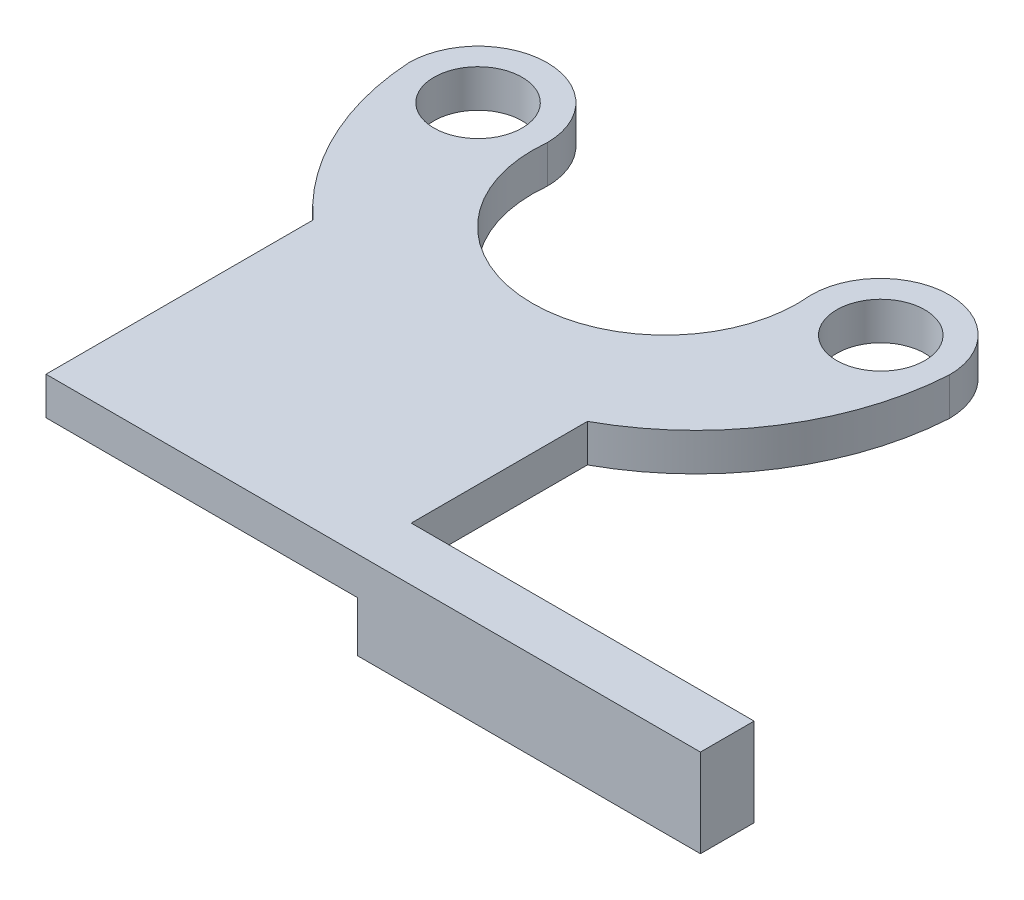
ISO-10303-21;
HEADER;
FILE_DESCRIPTION(('STEP AP214'),'2;1');
FILE_NAME('part.step','',(''),(''),'','','');
FILE_SCHEMA(('AUTOMOTIVE_DESIGN { 1 0 10303 214 1 1 1 1 }'));
ENDSEC;
DATA;
#1=APPLICATION_CONTEXT('core data for automotive mechanical design processes');
#2=APPLICATION_PROTOCOL_DEFINITION('international standard','automotive_design',2000,#1);
#3=PRODUCT_CONTEXT('',#1,'mechanical');
#4=PRODUCT('Part','Part','',(#3));
#5=PRODUCT_RELATED_PRODUCT_CATEGORY('part','',(#4));
#6=PRODUCT_DEFINITION_FORMATION('','',#4);
#7=PRODUCT_DEFINITION_CONTEXT('part definition',#1,'design');
#8=PRODUCT_DEFINITION('design','',#6,#7);
#9=PRODUCT_DEFINITION_SHAPE('','',#8);
#10=(LENGTH_UNIT() NAMED_UNIT(*) SI_UNIT(.MILLI.,.METRE.));
#11=(NAMED_UNIT(*) PLANE_ANGLE_UNIT() SI_UNIT($,.RADIAN.));
#12=(NAMED_UNIT(*) SI_UNIT($,.STERADIAN.) SOLID_ANGLE_UNIT());
#13=UNCERTAINTY_MEASURE_WITH_UNIT(LENGTH_MEASURE(1.E-05),#10,'distance_accuracy_value','');
#14=(GEOMETRIC_REPRESENTATION_CONTEXT(3) GLOBAL_UNCERTAINTY_ASSIGNED_CONTEXT((#13)) GLOBAL_UNIT_ASSIGNED_CONTEXT((#10,
#11,#12)) REPRESENTATION_CONTEXT('',''));
#15=CARTESIAN_POINT('',(0.,0.,0.));
#16=DIRECTION('',(0.,0.,1.));
#17=DIRECTION('',(1.,0.,0.));
#18=AXIS2_PLACEMENT_3D('',#15,#16,#17);
#19=CARTESIAN_POINT('',(-0.00974471247959803,1.5,0.557573359080302));
#20=DIRECTION('',(0.,1.,0.));
#21=DIRECTION('',(0.,0.,1.));
#22=AXIS2_PLACEMENT_3D('',#19,#20,#21);
#23=PLANE('',#22);
#24=DIRECTION('',(1.,0.,0.));
#25=VECTOR('',#24,1.);
#26=CARTESIAN_POINT('',(-7.23910045960443,1.5,17.9247339354452));
#27=LINE('',#26,#25);
#28=CARTESIAN_POINT('',(-7.23910045960443,1.5,17.9247339354452));
#29=VERTEX_POINT('',#28);
#30=CARTESIAN_POINT('',(18.7608995403956,1.5,17.9247339354452));
#31=VERTEX_POINT('',#30);
#32=EDGE_CURVE('E198',#29,#31,#27,.T.);
#33=ORIENTED_EDGE('',*,*,#32,.T.);
#34=DIRECTION('',(0.,0.,-1.));
#35=VECTOR('',#34,1.);
#36=CARTESIAN_POINT('',(18.7608995403956,1.5,15.7927993639687));
#37=LINE('',#36,#35);
#38=CARTESIAN_POINT('',(18.7608995403956,1.5,15.7927993639687));
#39=VERTEX_POINT('',#38);
#40=EDGE_CURVE('E201',#31,#39,#37,.T.);
#41=ORIENTED_EDGE('',*,*,#40,.T.);
#42=DIRECTION('',(-1.,0.,0.));
#43=VECTOR('',#42,1.);
#44=CARTESIAN_POINT('',(18.7608995403956,1.5,15.7927993639687));
#45=LINE('',#44,#43);
#46=CARTESIAN_POINT('',(5.13878703281565,1.5,15.7927993639687));
#47=VERTEX_POINT('',#46);
#48=EDGE_CURVE('E126',#39,#47,#45,.T.);
#49=ORIENTED_EDGE('',*,*,#48,.T.);
#50=DIRECTION('',(0.,0.,-1.));
#51=VECTOR('',#50,1.);
#52=CARTESIAN_POINT('',(5.13878703281565,1.5,15.7927993639687));
#53=LINE('',#52,#51);
#54=CARTESIAN_POINT('',(5.13878703281565,1.5,8.79279936396866));
#55=VERTEX_POINT('',#54);
#56=EDGE_CURVE('E120',#47,#55,#53,.T.);
#57=ORIENTED_EDGE('',*,*,#56,.T.);
#58=CARTESIAN_POINT('',(-0.00974471247960191,1.5,-0.655785681920986));
#59=DIRECTION('',(0.,1.,0.));
#60=DIRECTION('',(0.,0.,-1.));
#61=AXIS2_PLACEMENT_3D('',#58,#59,#60);
#62=CIRCLE('',#61,10.7602573622438);
#63=CARTESIAN_POINT('',(10.7305105750408,1.5,0.));
#64=VERTEX_POINT('',#63);
#65=EDGE_CURVE('E124',#55,#64,#62,.T.);
#66=ORIENTED_EDGE('',*,*,#65,.T.);
#67=CARTESIAN_POINT('',(7.9805105750408,1.5,0.));
#68=DIRECTION('',(0.,1.,0.));
#69=DIRECTION('',(0.,0.,1.));
#70=AXIS2_PLACEMENT_3D('',#67,#68,#69);
#71=CIRCLE('',#70,2.75);
#72=CARTESIAN_POINT('',(5.2305105750408,1.5,0.));
#73=VERTEX_POINT('',#72);
#74=EDGE_CURVE('E58',#64,#73,#71,.T.);
#75=ORIENTED_EDGE('',*,*,#74,.T.);
#76=CARTESIAN_POINT('',(-0.00974471247959803,1.5,0.557573359080302));
#77=DIRECTION('',(0.,-1.,0.));
#78=DIRECTION('',(0.,0.,1.));
#79=AXIS2_PLACEMENT_3D('',#76,#77,#78);
#80=CIRCLE('',#79,5.26983524686888);
#81=CARTESIAN_POINT('',(-5.25,1.5,0.));
#82=VERTEX_POINT('',#81);
#83=EDGE_CURVE('E160',#73,#82,#80,.T.);
#84=ORIENTED_EDGE('',*,*,#83,.T.);
#85=CARTESIAN_POINT('',(-8.,1.5,0.));
#86=DIRECTION('',(0.,1.,0.));
#87=DIRECTION('',(0.,0.,1.));
#88=AXIS2_PLACEMENT_3D('',#85,#86,#87);
#89=CIRCLE('',#88,2.75);
#90=CARTESIAN_POINT('',(-10.75,1.5,0.));
#91=VERTEX_POINT('',#90);
#92=EDGE_CURVE('E99',#82,#91,#89,.T.);
#93=ORIENTED_EDGE('',*,*,#92,.T.);
#94=CARTESIAN_POINT('',(-0.00974471247960191,1.5,-0.655785681920986));
#95=DIRECTION('',(0.,1.,0.));
#96=DIRECTION('',(0.,0.,-1.));
#97=AXIS2_PLACEMENT_3D('',#94,#95,#96);
#98=CIRCLE('',#97,10.7602573622438);
#99=CARTESIAN_POINT('',(-7.23910045960442,1.5,7.31412987492376));
#100=VERTEX_POINT('',#99);
#101=EDGE_CURVE('E181',#91,#100,#98,.T.);
#102=ORIENTED_EDGE('',*,*,#101,.T.);
#103=DIRECTION('',(0.,0.,1.));
#104=VECTOR('',#103,1.);
#105=CARTESIAN_POINT('',(-7.23910045960442,1.5,7.31412987492375));
#106=LINE('',#105,#104);
#107=EDGE_CURVE('E202',#100,#29,#106,.T.);
#108=ORIENTED_EDGE('',*,*,#107,.T.);
#109=EDGE_LOOP('',(#33,#41,#49,#57,#66,#75,#84,#93,#102,#108));
#110=FACE_BOUND('',#109,.T.);
#111=CARTESIAN_POINT('',(-8.,1.5,0.));
#112=DIRECTION('',(0.,1.,0.));
#113=DIRECTION('',(0.,0.,1.));
#114=AXIS2_PLACEMENT_3D('',#111,#112,#113);
#115=CIRCLE('',#114,1.75);
#116=CARTESIAN_POINT('',(-8.,1.5,1.75));
#117=VERTEX_POINT('',#116);
#118=EDGE_CURVE('E148',#117,#117,#115,.T.);
#119=ORIENTED_EDGE('',*,*,#118,.F.);
#120=EDGE_LOOP('',(#119));
#121=FACE_BOUND('',#120,.T.);
#122=CARTESIAN_POINT('',(8.,1.5,0.));
#123=DIRECTION('',(0.,1.,0.));
#124=DIRECTION('',(0.,0.,1.));
#125=AXIS2_PLACEMENT_3D('',#122,#123,#124);
#126=CIRCLE('',#125,1.75);
#127=CARTESIAN_POINT('',(8.,1.5,1.75000000000006));
#128=VERTEX_POINT('',#127);
#129=EDGE_CURVE('E213',#128,#128,#126,.T.);
#130=ORIENTED_EDGE('',*,*,#129,.F.);
#131=EDGE_LOOP('',(#130));
#132=FACE_BOUND('',#131,.T.);
#133=ADVANCED_FACE('F41',(#110,#121,#132),#23,.T.);
#134=CARTESIAN_POINT('',(-0.00974471247959803,0.,0.557573359080302));
#135=DIRECTION('',(0.,1.,0.));
#136=DIRECTION('',(0.,0.,1.));
#137=AXIS2_PLACEMENT_3D('',#134,#135,#136);
#138=PLANE('',#137);
#139=DIRECTION('',(0.,0.,-1.));
#140=VECTOR('',#139,1.);
#141=CARTESIAN_POINT('',(5.13878703281565,0.,15.7927993639687));
#142=LINE('',#141,#140);
#143=CARTESIAN_POINT('',(5.13878703281565,0.,15.7927993639687));
#144=VERTEX_POINT('',#143);
#145=CARTESIAN_POINT('',(5.13878703281565,0.,8.79279936396866));
#146=VERTEX_POINT('',#145);
#147=EDGE_CURVE('E134',#144,#146,#142,.T.);
#148=ORIENTED_EDGE('',*,*,#147,.F.);
#149=DIRECTION('',(0.,0.,1.));
#150=VECTOR('',#149,1.);
#151=CARTESIAN_POINT('',(5.13878703281565,0.,0.557573359080302));
#152=LINE('',#151,#150);
#153=CARTESIAN_POINT('',(5.13878703281565,0.,17.9247339354452));
#154=VERTEX_POINT('',#153);
#155=EDGE_CURVE('E219',#144,#154,#152,.T.);
#156=ORIENTED_EDGE('',*,*,#155,.T.);
#157=DIRECTION('',(1.,0.,0.));
#158=VECTOR('',#157,1.);
#159=CARTESIAN_POINT('',(-7.23910045960443,0.,17.9247339354452));
#160=LINE('',#159,#158);
#161=CARTESIAN_POINT('',(-7.23910045960443,0.,17.9247339354452));
#162=VERTEX_POINT('',#161);
#163=EDGE_CURVE('E154',#162,#154,#160,.T.);
#164=ORIENTED_EDGE('',*,*,#163,.F.);
#165=DIRECTION('',(0.,0.,1.));
#166=VECTOR('',#165,1.);
#167=CARTESIAN_POINT('',(-7.23910045960442,0.,7.31412987492375));
#168=LINE('',#167,#166);
#169=CARTESIAN_POINT('',(-7.23910045960442,0.,7.31412987492376));
#170=VERTEX_POINT('',#169);
#171=EDGE_CURVE('E152',#170,#162,#168,.T.);
#172=ORIENTED_EDGE('',*,*,#171,.F.);
#173=CARTESIAN_POINT('',(-0.00974471247960191,0.,-0.655785681920986));
#174=DIRECTION('',(0.,1.,0.));
#175=DIRECTION('',(0.,0.,-1.));
#176=AXIS2_PLACEMENT_3D('',#173,#174,#175);
#177=CIRCLE('',#176,10.7602573622438);
#178=CARTESIAN_POINT('',(-10.75,0.,0.));
#179=VERTEX_POINT('',#178);
#180=EDGE_CURVE('E150',#179,#170,#177,.T.);
#181=ORIENTED_EDGE('',*,*,#180,.F.);
#182=CARTESIAN_POINT('',(-8.,0.,0.));
#183=DIRECTION('',(0.,1.,0.));
#184=DIRECTION('',(0.,0.,1.));
#185=AXIS2_PLACEMENT_3D('',#182,#183,#184);
#186=CIRCLE('',#185,2.75);
#187=CARTESIAN_POINT('',(-5.25,0.,0.));
#188=VERTEX_POINT('',#187);
#189=EDGE_CURVE('E147',#188,#179,#186,.T.);
#190=ORIENTED_EDGE('',*,*,#189,.F.);
#191=CARTESIAN_POINT('',(-0.00974471247959803,0.,0.557573359080302));
#192=DIRECTION('',(0.,-1.,0.));
#193=DIRECTION('',(0.,0.,1.));
#194=AXIS2_PLACEMENT_3D('',#191,#192,#193);
#195=CIRCLE('',#194,5.26983524686888);
#196=CARTESIAN_POINT('',(5.2305105750408,0.,0.));
#197=VERTEX_POINT('',#196);
#198=EDGE_CURVE('E144',#197,#188,#195,.T.);
#199=ORIENTED_EDGE('',*,*,#198,.F.);
#200=CARTESIAN_POINT('',(7.9805105750408,0.,0.));
#201=DIRECTION('',(0.,1.,0.));
#202=DIRECTION('',(0.,0.,1.));
#203=AXIS2_PLACEMENT_3D('',#200,#201,#202);
#204=CIRCLE('',#203,2.75);
#205=CARTESIAN_POINT('',(10.7305105750408,0.,0.));
#206=VERTEX_POINT('',#205);
#207=EDGE_CURVE('E91',#206,#197,#204,.T.);
#208=ORIENTED_EDGE('',*,*,#207,.F.);
#209=CARTESIAN_POINT('',(-0.00974471247960191,0.,-0.655785681920986));
#210=DIRECTION('',(0.,1.,0.));
#211=DIRECTION('',(0.,0.,-1.));
#212=AXIS2_PLACEMENT_3D('',#209,#210,#211);
#213=CIRCLE('',#212,10.7602573622438);
#214=EDGE_CURVE('E85',#146,#206,#213,.T.);
#215=ORIENTED_EDGE('',*,*,#214,.F.);
#216=EDGE_LOOP('',(#148,#156,#164,#172,#181,#190,#199,#208,#215));
#217=FACE_BOUND('',#216,.T.);
#218=CARTESIAN_POINT('',(-8.,0.,0.));
#219=DIRECTION('',(0.,1.,0.));
#220=DIRECTION('',(0.,0.,1.));
#221=AXIS2_PLACEMENT_3D('',#218,#219,#220);
#222=CIRCLE('',#221,1.75);
#223=CARTESIAN_POINT('',(-8.,0.,1.75));
#224=VERTEX_POINT('',#223);
#225=EDGE_CURVE('E210',#224,#224,#222,.T.);
#226=ORIENTED_EDGE('',*,*,#225,.T.);
#227=EDGE_LOOP('',(#226));
#228=FACE_BOUND('',#227,.T.);
#229=CARTESIAN_POINT('',(8.,0.,0.));
#230=DIRECTION('',(0.,1.,0.));
#231=DIRECTION('',(0.,0.,1.));
#232=AXIS2_PLACEMENT_3D('',#229,#230,#231);
#233=CIRCLE('',#232,1.75);
#234=CARTESIAN_POINT('',(8.,0.,1.75000000000006));
#235=VERTEX_POINT('',#234);
#236=EDGE_CURVE('E216',#235,#235,#233,.T.);
#237=ORIENTED_EDGE('',*,*,#236,.T.);
#238=EDGE_LOOP('',(#237));
#239=FACE_BOUND('',#238,.T.);
#240=ADVANCED_FACE('F184',(#217,#228,#239),#138,.F.);
#241=CARTESIAN_POINT('',(-0.00974471247959803,1.5,0.557573359080302));
#242=DIRECTION('',(0.,-1.,0.));
#243=DIRECTION('',(0.,0.,-1.));
#244=AXIS2_PLACEMENT_3D('',#241,#242,#243);
#245=CYLINDRICAL_SURFACE('',#244,5.26983524686888);
#246=ORIENTED_EDGE('',*,*,#198,.T.);
#247=DIRECTION('',(0.,-1.,0.));
#248=VECTOR('',#247,1.);
#249=CARTESIAN_POINT('',(-5.25,1.5,0.));
#250=LINE('',#249,#248);
#251=EDGE_CURVE('E11',#82,#188,#250,.T.);
#252=ORIENTED_EDGE('',*,*,#251,.F.);
#253=ORIENTED_EDGE('',*,*,#83,.F.);
#254=DIRECTION('',(0.,-1.,0.));
#255=VECTOR('',#254,1.);
#256=CARTESIAN_POINT('',(5.2305105750408,1.5,0.));
#257=LINE('',#256,#255);
#258=EDGE_CURVE('E140',#73,#197,#257,.T.);
#259=ORIENTED_EDGE('',*,*,#258,.T.);
#260=EDGE_LOOP('',(#246,#252,#253,#259));
#261=FACE_BOUND('',#260,.T.);
#262=ADVANCED_FACE('F43',(#261),#245,.F.);
#263=CARTESIAN_POINT('',(-8.,1.5,0.));
#264=DIRECTION('',(0.,-1.,0.));
#265=DIRECTION('',(0.,0.,-1.));
#266=AXIS2_PLACEMENT_3D('',#263,#264,#265);
#267=CYLINDRICAL_SURFACE('',#266,2.75);
#268=ORIENTED_EDGE('',*,*,#189,.T.);
#269=DIRECTION('',(0.,-1.,0.));
#270=VECTOR('',#269,1.);
#271=CARTESIAN_POINT('',(-10.75,1.5,0.));
#272=LINE('',#271,#270);
#273=EDGE_CURVE('E50',#91,#179,#272,.T.);
#274=ORIENTED_EDGE('',*,*,#273,.F.);
#275=ORIENTED_EDGE('',*,*,#92,.F.);
#276=ORIENTED_EDGE('',*,*,#251,.T.);
#277=EDGE_LOOP('',(#268,#274,#275,#276));
#278=FACE_BOUND('',#277,.T.);
#279=ADVANCED_FACE('F341',(#278),#267,.T.);
#280=CARTESIAN_POINT('',(-0.00974471247960191,1.5,-0.655785681920986));
#281=DIRECTION('',(0.,-1.,0.));
#282=DIRECTION('',(0.,0.,-1.));
#283=AXIS2_PLACEMENT_3D('',#280,#281,#282);
#284=CYLINDRICAL_SURFACE('',#283,10.7602573622438);
#285=ORIENTED_EDGE('',*,*,#180,.T.);
#286=DIRECTION('',(0.,-1.,0.));
#287=VECTOR('',#286,1.);
#288=CARTESIAN_POINT('',(-7.23910045960442,1.5,7.31412987492376));
#289=LINE('',#288,#287);
#290=EDGE_CURVE('E173',#100,#170,#289,.T.);
#291=ORIENTED_EDGE('',*,*,#290,.F.);
#292=ORIENTED_EDGE('',*,*,#101,.F.);
#293=ORIENTED_EDGE('',*,*,#273,.T.);
#294=EDGE_LOOP('',(#285,#291,#292,#293));
#295=FACE_BOUND('',#294,.T.);
#296=ADVANCED_FACE('F179',(#295),#284,.T.);
#297=CARTESIAN_POINT('',(-7.23910045960442,1.5,7.31412987492375));
#298=DIRECTION('',(1.,0.,0.));
#299=DIRECTION('',(0.,0.,-1.));
#300=AXIS2_PLACEMENT_3D('',#297,#298,#299);
#301=PLANE('',#300);
#302=ORIENTED_EDGE('',*,*,#171,.T.);
#303=DIRECTION('',(0.,-1.,0.));
#304=VECTOR('',#303,1.);
#305=CARTESIAN_POINT('',(-7.23910045960443,1.5,17.9247339354452));
#306=LINE('',#305,#304);
#307=EDGE_CURVE('E170',#29,#162,#306,.T.);
#308=ORIENTED_EDGE('',*,*,#307,.F.);
#309=ORIENTED_EDGE('',*,*,#107,.F.);
#310=ORIENTED_EDGE('',*,*,#290,.T.);
#311=EDGE_LOOP('',(#302,#308,#309,#310));
#312=FACE_BOUND('',#311,.T.);
#313=ADVANCED_FACE('F191',(#312),#301,.F.);
#314=CARTESIAN_POINT('',(-7.23910045960443,1.5,17.9247339354452));
#315=DIRECTION('',(0.,0.,-1.));
#316=DIRECTION('',(-1.,0.,0.));
#317=AXIS2_PLACEMENT_3D('',#314,#315,#316);
#318=PLANE('',#317);
#319=ORIENTED_EDGE('',*,*,#163,.T.);
#320=DIRECTION('',(0.,1.,0.));
#321=VECTOR('',#320,1.);
#322=CARTESIAN_POINT('',(5.13878703281565,-2.,17.9247339354452));
#323=LINE('',#322,#321);
#324=CARTESIAN_POINT('',(5.13878703281565,-2.,17.9247339354452));
#325=VERTEX_POINT('',#324);
#326=EDGE_CURVE('E224',#325,#154,#323,.T.);
#327=ORIENTED_EDGE('',*,*,#326,.F.);
#328=DIRECTION('',(1.,0.,0.));
#329=VECTOR('',#328,1.);
#330=CARTESIAN_POINT('',(5.13878703281565,-2.,17.9247339354452));
#331=LINE('',#330,#329);
#332=CARTESIAN_POINT('',(18.7608995403956,-2.,17.9247339354452));
#333=VERTEX_POINT('',#332);
#334=EDGE_CURVE('E235',#325,#333,#331,.T.);
#335=ORIENTED_EDGE('',*,*,#334,.T.);
#336=DIRECTION('',(0.,-1.,0.));
#337=VECTOR('',#336,1.);
#338=CARTESIAN_POINT('',(18.7608995403956,1.5,17.9247339354452));
#339=LINE('',#338,#337);
#340=EDGE_CURVE('E167',#31,#333,#339,.T.);
#341=ORIENTED_EDGE('',*,*,#340,.F.);
#342=ORIENTED_EDGE('',*,*,#32,.F.);
#343=ORIENTED_EDGE('',*,*,#307,.T.);
#344=EDGE_LOOP('',(#319,#327,#335,#341,#342,#343));
#345=FACE_BOUND('',#344,.T.);
#346=ADVANCED_FACE('F195',(#345),#318,.F.);
#347=CARTESIAN_POINT('',(18.7608995403956,1.5,15.7927993639687));
#348=DIRECTION('',(-1.,0.,0.));
#349=DIRECTION('',(0.,0.,1.));
#350=AXIS2_PLACEMENT_3D('',#347,#348,#349);
#351=PLANE('',#350);
#352=ORIENTED_EDGE('',*,*,#340,.T.);
#353=DIRECTION('',(0.,0.,-1.));
#354=VECTOR('',#353,1.);
#355=CARTESIAN_POINT('',(18.7608995403956,-2.,15.7927993639687));
#356=LINE('',#355,#354);
#357=CARTESIAN_POINT('',(18.7608995403956,-2.,15.7927993639687));
#358=VERTEX_POINT('',#357);
#359=EDGE_CURVE('E232',#333,#358,#356,.T.);
#360=ORIENTED_EDGE('',*,*,#359,.T.);
#361=DIRECTION('',(0.,-1.,0.));
#362=VECTOR('',#361,1.);
#363=CARTESIAN_POINT('',(18.7608995403956,1.5,15.7927993639687));
#364=LINE('',#363,#362);
#365=EDGE_CURVE('E164',#39,#358,#364,.T.);
#366=ORIENTED_EDGE('',*,*,#365,.F.);
#367=ORIENTED_EDGE('',*,*,#40,.F.);
#368=EDGE_LOOP('',(#352,#360,#366,#367));
#369=FACE_BOUND('',#368,.T.);
#370=ADVANCED_FACE('F261',(#369),#351,.F.);
#371=CARTESIAN_POINT('',(18.7608995403956,1.5,15.7927993639687));
#372=DIRECTION('',(0.,0.,1.));
#373=DIRECTION('',(1.,0.,0.));
#374=AXIS2_PLACEMENT_3D('',#371,#372,#373);
#375=PLANE('',#374);
#376=ORIENTED_EDGE('',*,*,#365,.T.);
#377=DIRECTION('',(-1.,0.,0.));
#378=VECTOR('',#377,1.);
#379=CARTESIAN_POINT('',(5.13878703281565,-2.,15.7927993639687));
#380=LINE('',#379,#378);
#381=CARTESIAN_POINT('',(5.13878703281565,-2.,15.7927993639687));
#382=VERTEX_POINT('',#381);
#383=EDGE_CURVE('E227',#358,#382,#380,.T.);
#384=ORIENTED_EDGE('',*,*,#383,.T.);
#385=DIRECTION('',(0.,1.,0.));
#386=VECTOR('',#385,1.);
#387=CARTESIAN_POINT('',(5.13878703281565,-2.,15.7927993639687));
#388=LINE('',#387,#386);
#389=EDGE_CURVE('E223',#382,#144,#388,.T.);
#390=ORIENTED_EDGE('',*,*,#389,.T.);
#391=DIRECTION('',(0.,-1.,0.));
#392=VECTOR('',#391,1.);
#393=CARTESIAN_POINT('',(5.13878703281565,1.5,15.7927993639687));
#394=LINE('',#393,#392);
#395=EDGE_CURVE('E135',#47,#144,#394,.T.);
#396=ORIENTED_EDGE('',*,*,#395,.F.);
#397=ORIENTED_EDGE('',*,*,#48,.F.);
#398=EDGE_LOOP('',(#376,#384,#390,#396,#397));
#399=FACE_BOUND('',#398,.T.);
#400=ADVANCED_FACE('F257',(#399),#375,.F.);
#401=CARTESIAN_POINT('',(5.13878703281565,1.5,15.7927993639687));
#402=DIRECTION('',(-1.,0.,0.));
#403=DIRECTION('',(0.,0.,1.));
#404=AXIS2_PLACEMENT_3D('',#401,#402,#403);
#405=PLANE('',#404);
#406=ORIENTED_EDGE('',*,*,#147,.T.);
#407=DIRECTION('',(0.,-1.,0.));
#408=VECTOR('',#407,1.);
#409=CARTESIAN_POINT('',(5.13878703281565,1.5,8.79279936396866));
#410=LINE('',#409,#408);
#411=EDGE_CURVE('E131',#55,#146,#410,.T.);
#412=ORIENTED_EDGE('',*,*,#411,.F.);
#413=ORIENTED_EDGE('',*,*,#56,.F.);
#414=ORIENTED_EDGE('',*,*,#395,.T.);
#415=EDGE_LOOP('',(#406,#412,#413,#414));
#416=FACE_BOUND('',#415,.T.);
#417=ADVANCED_FACE('F132',(#416),#405,.F.);
#418=CARTESIAN_POINT('',(-0.00974471247960191,1.5,-0.655785681920986));
#419=DIRECTION('',(0.,-1.,0.));
#420=DIRECTION('',(0.,0.,-1.));
#421=AXIS2_PLACEMENT_3D('',#418,#419,#420);
#422=CYLINDRICAL_SURFACE('',#421,10.7602573622438);
#423=ORIENTED_EDGE('',*,*,#214,.T.);
#424=DIRECTION('',(0.,-1.,0.));
#425=VECTOR('',#424,1.);
#426=CARTESIAN_POINT('',(10.7305105750408,1.5,0.));
#427=LINE('',#426,#425);
#428=EDGE_CURVE('E136',#64,#206,#427,.T.);
#429=ORIENTED_EDGE('',*,*,#428,.F.);
#430=ORIENTED_EDGE('',*,*,#65,.F.);
#431=ORIENTED_EDGE('',*,*,#411,.T.);
#432=EDGE_LOOP('',(#423,#429,#430,#431));
#433=FACE_BOUND('',#432,.T.);
#434=ADVANCED_FACE('F138',(#433),#422,.T.);
#435=CARTESIAN_POINT('',(7.9805105750408,1.5,0.));
#436=DIRECTION('',(0.,-1.,0.));
#437=DIRECTION('',(0.,0.,-1.));
#438=AXIS2_PLACEMENT_3D('',#435,#436,#437);
#439=CYLINDRICAL_SURFACE('',#438,2.75);
#440=ORIENTED_EDGE('',*,*,#207,.T.);
#441=ORIENTED_EDGE('',*,*,#258,.F.);
#442=ORIENTED_EDGE('',*,*,#74,.F.);
#443=ORIENTED_EDGE('',*,*,#428,.T.);
#444=EDGE_LOOP('',(#440,#441,#442,#443));
#445=FACE_BOUND('',#444,.T.);
#446=ADVANCED_FACE('F266',(#445),#439,.T.);
#447=CARTESIAN_POINT('',(-8.,1.5,0.));
#448=DIRECTION('',(0.,-1.,0.));
#449=DIRECTION('',(0.,0.,-1.));
#450=AXIS2_PLACEMENT_3D('',#447,#448,#449);
#451=CYLINDRICAL_SURFACE('',#450,1.75);
#452=ORIENTED_EDGE('',*,*,#118,.T.);
#453=EDGE_LOOP('',(#452));
#454=FACE_BOUND('',#453,.T.);
#455=ORIENTED_EDGE('',*,*,#225,.F.);
#456=EDGE_LOOP('',(#455));
#457=FACE_BOUND('',#456,.T.);
#458=ADVANCED_FACE('F268',(#454,#457),#451,.F.);
#459=CARTESIAN_POINT('',(8.,1.5,0.));
#460=DIRECTION('',(0.,-1.,0.));
#461=DIRECTION('',(0.,0.,-1.));
#462=AXIS2_PLACEMENT_3D('',#459,#460,#461);
#463=CYLINDRICAL_SURFACE('',#462,1.75);
#464=ORIENTED_EDGE('',*,*,#129,.T.);
#465=EDGE_LOOP('',(#464));
#466=FACE_BOUND('',#465,.T.);
#467=ORIENTED_EDGE('',*,*,#236,.F.);
#468=EDGE_LOOP('',(#467));
#469=FACE_BOUND('',#468,.T.);
#470=ADVANCED_FACE('F274',(#466,#469),#463,.F.);
#471=CARTESIAN_POINT('',(5.13878703281565,-2.,15.7927993639687));
#472=DIRECTION('',(-1.,0.,0.));
#473=DIRECTION('',(0.,0.,1.));
#474=AXIS2_PLACEMENT_3D('',#471,#472,#473);
#475=PLANE('',#474);
#476=ORIENTED_EDGE('',*,*,#155,.F.);
#477=ORIENTED_EDGE('',*,*,#389,.F.);
#478=DIRECTION('',(0.,0.,1.));
#479=VECTOR('',#478,1.);
#480=CARTESIAN_POINT('',(5.13878703281565,-2.,15.7927993639687));
#481=LINE('',#480,#479);
#482=EDGE_CURVE('E237',#382,#325,#481,.T.);
#483=ORIENTED_EDGE('',*,*,#482,.T.);
#484=ORIENTED_EDGE('',*,*,#326,.T.);
#485=EDGE_LOOP('',(#476,#477,#483,#484));
#486=FACE_BOUND('',#485,.T.);
#487=ADVANCED_FACE('F244',(#486),#475,.T.);
#488=CARTESIAN_POINT('',(0.,-2.,0.));
#489=DIRECTION('',(0.,1.,0.));
#490=DIRECTION('',(0.,0.,1.));
#491=AXIS2_PLACEMENT_3D('',#488,#489,#490);
#492=PLANE('',#491);
#493=ORIENTED_EDGE('',*,*,#482,.F.);
#494=ORIENTED_EDGE('',*,*,#383,.F.);
#495=ORIENTED_EDGE('',*,*,#359,.F.);
#496=ORIENTED_EDGE('',*,*,#334,.F.);
#497=EDGE_LOOP('',(#493,#494,#495,#496));
#498=FACE_BOUND('',#497,.T.);
#499=ADVANCED_FACE('F251',(#498),#492,.F.);
#500=CLOSED_SHELL('',(#133,#240,#262,#279,#296,#313,#346,#370,#400,#417,#434,#446,#458,#470,
#487,#499));
#501=MANIFOLD_SOLID_BREP('B2',#500);
#502=ADVANCED_BREP_SHAPE_REPRESENTATION('',(#18,#501),#14);
#503=SHAPE_DEFINITION_REPRESENTATION(#9,#502);
ENDSEC;
END-ISO-10303-21;
